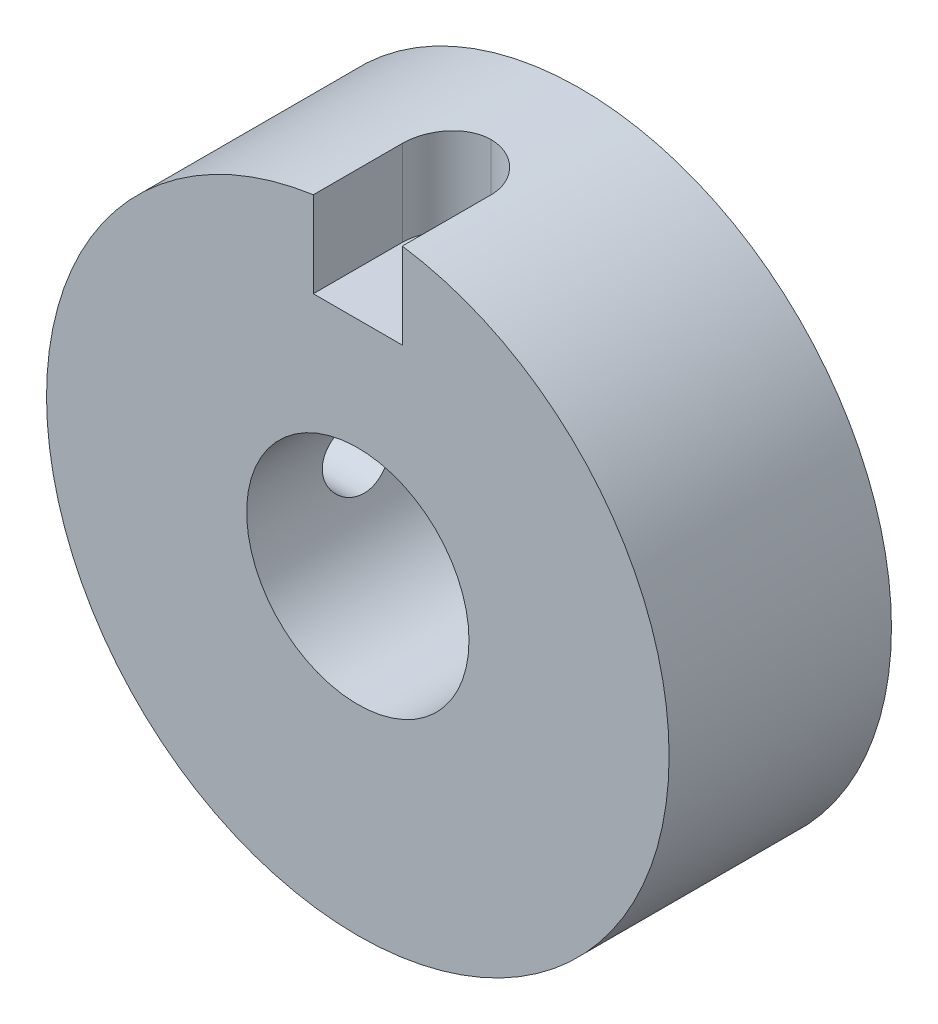
ISO-10303-21;
HEADER;
FILE_DESCRIPTION(('STEP AP214'),'2;1');
FILE_NAME('part.step','',(''),(''),'','','');
FILE_SCHEMA(('AUTOMOTIVE_DESIGN { 1 0 10303 214 1 1 1 1 }'));
ENDSEC;
DATA;
#1=APPLICATION_CONTEXT('core data for automotive mechanical design processes');
#2=APPLICATION_PROTOCOL_DEFINITION('international standard','automotive_design',2000,#1);
#3=PRODUCT_CONTEXT('',#1,'mechanical');
#4=PRODUCT('Part','Part','',(#3));
#5=PRODUCT_RELATED_PRODUCT_CATEGORY('part','',(#4));
#6=PRODUCT_DEFINITION_FORMATION('','',#4);
#7=PRODUCT_DEFINITION_CONTEXT('part definition',#1,'design');
#8=PRODUCT_DEFINITION('design','',#6,#7);
#9=PRODUCT_DEFINITION_SHAPE('','',#8);
#10=(LENGTH_UNIT() NAMED_UNIT(*) SI_UNIT(.MILLI.,.METRE.));
#11=(NAMED_UNIT(*) PLANE_ANGLE_UNIT() SI_UNIT($,.RADIAN.));
#12=(NAMED_UNIT(*) SI_UNIT($,.STERADIAN.) SOLID_ANGLE_UNIT());
#13=UNCERTAINTY_MEASURE_WITH_UNIT(LENGTH_MEASURE(1.E-05),#10,'distance_accuracy_value','');
#14=(GEOMETRIC_REPRESENTATION_CONTEXT(3) GLOBAL_UNCERTAINTY_ASSIGNED_CONTEXT((#13)) GLOBAL_UNIT_ASSIGNED_CONTEXT((#10,
#11,#12)) REPRESENTATION_CONTEXT('',''));
#15=CARTESIAN_POINT('',(0.,0.,0.));
#16=DIRECTION('',(0.,0.,1.));
#17=DIRECTION('',(1.,0.,0.));
#18=AXIS2_PLACEMENT_3D('',#15,#16,#17);
#19=CARTESIAN_POINT('',(0.,0.,0.));
#20=DIRECTION('',(0.,0.,1.));
#21=DIRECTION('',(1.,0.,0.));
#22=AXIS2_PLACEMENT_3D('',#19,#20,#21);
#23=CYLINDRICAL_SURFACE('',#22,12.5);
#24=CARTESIAN_POINT('',(-12.4996778223391,-0.0897459621555831,8.5));
#25=CARTESIAN_POINT('',(-12.4981044523452,-0.308779795776733,8.50000084706203));
#26=CARTESIAN_POINT('',(-12.4907211095766,-0.527781261981423,8.51805027812865));
#27=CARTESIAN_POINT('',(-12.4650128484776,-0.959277121958953,8.58953121023585));
#28=CARTESIAN_POINT('',(-12.4466856909387,-1.17177017469173,8.64296995250977));
#29=CARTESIAN_POINT('',(-12.4009680397116,-1.58397002797273,8.78319714131737));
#30=CARTESIAN_POINT('',(-12.3735925538041,-1.78369735180202,8.86993040293113));
#31=CARTESIAN_POINT('',(-12.3124749550891,-2.16574197133347,9.07404404306179));
#32=CARTESIAN_POINT('',(-12.2787317545973,-2.34805628465323,9.19142965869639));
#33=CARTESIAN_POINT('',(-12.2070983764861,-2.69616339041527,9.45762822606472));
#34=CARTESIAN_POINT('',(-12.1691141975337,-2.8612969600371,9.60727790169316));
#35=CARTESIAN_POINT('',(-12.0937942941893,-3.16458650573428,9.9319798457147));
#36=CARTESIAN_POINT('',(-12.0564587012965,-3.30273706790613,10.1070371996789));
#37=CARTESIAN_POINT('',(-11.9855565201995,-3.55156940278365,10.4831008964861));
#38=CARTESIAN_POINT('',(-11.9521104661916,-3.66145999403281,10.6846555486751));
#39=CARTESIAN_POINT('',(-11.8941837593139,-3.84548690546643,11.1046741770124));
#40=CARTESIAN_POINT('',(-11.8697004220964,-3.91963393301526,11.3231330665312));
#41=CARTESIAN_POINT('',(-11.8335101084463,-4.02755501232613,11.7629851131692));
#42=CARTESIAN_POINT('',(-11.8214000844247,-4.06260634646956,11.9840308239172));
#43=CARTESIAN_POINT('',(-11.8101038637609,-4.09533586524768,12.4291719116742));
#44=CARTESIAN_POINT('',(-11.8109139036736,-4.09302493301794,12.6532663816169));
#45=CARTESIAN_POINT('',(-11.8250207602558,-4.0520716189803,13.0878365656611));
#46=CARTESIAN_POINT('',(-11.8377749589872,-4.01500794872531,13.2984816247527));
#47=CARTESIAN_POINT('',(-11.8734767920111,-3.90815684783518,13.7103813497785));
#48=CARTESIAN_POINT('',(-11.8964255908698,-3.83836567856852,13.9116349399879));
#49=CARTESIAN_POINT('',(-11.950384608469,-3.66694203527177,14.3027755561789));
#50=CARTESIAN_POINT('',(-11.981517478085,-3.56481981331049,14.4924303057237));
#51=CARTESIAN_POINT('',(-12.0483400439735,-3.33198723460588,14.8524146334126));
#52=CARTESIAN_POINT('',(-12.0840310066111,-3.20126892585111,15.0227388160554));
#53=CARTESIAN_POINT('',(-12.1582110174102,-2.9072294003563,15.3482012108478));
#54=CARTESIAN_POINT('',(-12.1967506540768,-2.74260260900515,15.5021506386753));
#55=CARTESIAN_POINT('',(-12.2708260023692,-2.38942355562322,15.7805561505207));
#56=CARTESIAN_POINT('',(-12.3063614271303,-2.20086901307986,15.9050094200644));
#57=CARTESIAN_POINT('',(-12.3710119135199,-1.80253554515492,16.1219171514759));
#58=CARTESIAN_POINT('',(-12.4000575367011,-1.59255913176364,16.2140310514567));
#59=CARTESIAN_POINT('',(-12.4480673935584,-1.15892910476285,16.3612468309745));
#60=CARTESIAN_POINT('',(-12.4670348612947,-0.935279904443451,16.4163605852835));
#61=CARTESIAN_POINT('',(-12.4922836355038,-0.490379305922082,16.4859905373786));
#62=CARTESIAN_POINT('',(-12.4990483118146,-0.269398613377312,16.5020627774838));
#63=CARTESIAN_POINT('',(-12.5007627748621,0.172209937213821,16.4975138476408));
#64=CARTESIAN_POINT('',(-12.4957145151713,0.392837847563538,16.4768987450224));
#65=CARTESIAN_POINT('',(-12.4747999111584,0.821016863191551,16.4008307520688));
#66=CARTESIAN_POINT('',(-12.459241080117,1.02876118816997,16.3463715865508));
#67=CARTESIAN_POINT('',(-12.419343844758,1.43213542691959,16.2053400316766));
#68=CARTESIAN_POINT('',(-12.3950044104534,1.62776391631678,16.1187638748816));
#69=CARTESIAN_POINT('',(-12.3394340460404,2.00645888350115,15.9137040497251));
#70=CARTESIAN_POINT('',(-12.3080552601453,2.18912458598311,15.7945215285238));
#71=CARTESIAN_POINT('',(-12.2420423496594,2.53239078311192,15.528462539468));
#72=CARTESIAN_POINT('',(-12.2074073267932,2.69298515883813,15.3815784184562));
#73=CARTESIAN_POINT('',(-12.1370667660441,2.99442399901125,15.0571301157744));
#74=CARTESIAN_POINT('',(-12.1013759157265,3.13418213246274,14.8785512226872));
#75=CARTESIAN_POINT('',(-12.0345085850012,3.3818810481371,14.4997523114599));
#76=CARTESIAN_POINT('',(-12.0033321029297,3.48982184208676,14.2995323012961));
#77=CARTESIAN_POINT('',(-11.9493660479752,3.67036328889093,13.8830988415737));
#78=CARTESIAN_POINT('',(-11.9265604927611,3.74303137322143,13.6669168261438));
#79=CARTESIAN_POINT('',(-11.8922509031079,3.85066493623664,13.2245230262504));
#80=CARTESIAN_POINT('',(-11.8807425273946,3.88564489819771,12.9983151294805));
#81=CARTESIAN_POINT('',(-11.8708251416354,3.91583157516731,12.5532716606386));
#82=CARTESIAN_POINT('',(-11.8718480956732,3.9127629259007,12.3345644225548));
#83=CARTESIAN_POINT('',(-11.8854867939859,3.87113320275414,11.9009418113832));
#84=CARTESIAN_POINT('',(-11.898101966398,3.83257387968632,11.6860262517789));
#85=CARTESIAN_POINT('',(-11.9330682019857,3.72224781420406,11.2693702671742));
#86=CARTESIAN_POINT('',(-11.95526556233,3.65100425481284,11.0674774118319));
#87=CARTESIAN_POINT('',(-12.0068078990468,3.477742861443,10.6783495541493));
#88=CARTESIAN_POINT('',(-12.0361543479721,3.37571868631014,10.4911175821368));
#89=CARTESIAN_POINT('',(-12.1000622843927,3.13911557554125,10.1286922572677));
#90=CARTESIAN_POINT('',(-12.1347829078743,3.00341894046459,9.9542567078173));
#91=CARTESIAN_POINT('',(-12.2047139736414,2.70524916480784,9.63006498979919));
#92=CARTESIAN_POINT('',(-12.2399245415843,2.54276903462859,9.4803152838703));
#93=CARTESIAN_POINT('',(-12.3081473969799,2.18927005128843,9.20486773777867));
#94=CARTESIAN_POINT('',(-12.3410509332938,1.99749484526288,9.08011062870025));
#95=CARTESIAN_POINT('',(-12.3995350062219,1.59463647980861,8.86475945789312));
#96=CARTESIAN_POINT('',(-12.4251182076853,1.38356038357415,8.77415296036855));
#97=CARTESIAN_POINT('',(-12.4643985330404,0.964250615370552,8.63552252431404));
#98=CARTESIAN_POINT('',(-12.4788351696646,0.756962585041859,8.58484350576535));
#99=CARTESIAN_POINT('',(-12.4972391526811,0.336523337318486,8.51708537459931));
#100=CARTESIAN_POINT('',(-12.5012087070917,0.123373366080645,8.49999917581093));
#101=CARTESIAN_POINT('',(-12.4996778223391,-0.0897459621555831,8.5));
#102=B_SPLINE_CURVE_WITH_KNOTS('',3,(#24,#25,#26,#27,#28,#29,#30,#31,#32,#33,#34,#35,#36,#37,
#38,#39,#40,#41,#42,#43,#44,#45,#46,#47,#48,#49,#50,#51,#52,#53,#54,#55,#56,#57,#58,#59,#60,#61,
#62,#63,#64,#65,#66,#67,#68,#69,#70,#71,#72,#73,#74,#75,#76,#77,#78,#79,#80,#81,#82,#83,#84,#85,
#86,#87,#88,#89,#90,#91,#92,#93,#94,#95,#96,#97,#98,#99,#100,#101),.UNSPECIFIED.,.T.,.F.,(4,2,2,
2,2,2,2,2,2,2,2,2,2,2,2,2,2,2,2,2,2,2,2,2,2,2,2,2,2,2,2,2,2,2,2,2,2,2,4),(0.,0.656332500111828,
1.31279933812617,1.96818276264653,2.62367823626036,3.29882650153832,3.97411009054382,
4.66663091861036,5.35894416559027,6.02790842814876,6.69667783374932,7.33646706114502,
7.97632939278524,8.62638962466568,9.27663085586789,9.95945828079062,10.6423508337604,
11.3322331272658,12.0218939049888,12.6835806324671,13.3451579407781,13.9881724023181,
14.6312623156306,15.2893918229874,15.9477034197023,16.6331381594277,17.3185726465248,
18.002691564177,18.6865474859389,19.3395239310475,19.9924681655022,20.6353068695584,
21.2782780961774,21.946410008502,22.6147165578184,23.3047603232122,23.9945525688614,
24.633297071077,25.2719068201323),.UNSPECIFIED.);
#103=CARTESIAN_POINT('',(-12.4996778223391,-0.0897459621555831,8.5));
#104=VERTEX_POINT('',#103);
#105=EDGE_CURVE('E175',#104,#104,#102,.T.);
#106=ORIENTED_EDGE('',*,*,#105,.T.);
#107=EDGE_LOOP('',(#106));
#108=FACE_BOUND('',#107,.T.);
#109=CARTESIAN_POINT('',(0.,0.,25.));
#110=DIRECTION('',(0.,0.,1.));
#111=DIRECTION('',(1.,0.,0.));
#112=AXIS2_PLACEMENT_3D('',#109,#110,#111);
#113=CIRCLE('',#112,12.5);
#114=CARTESIAN_POINT('',(12.5,0.,25.));
#115=VERTEX_POINT('',#114);
#116=EDGE_CURVE('E117',#115,#115,#113,.T.);
#117=ORIENTED_EDGE('',*,*,#116,.T.);
#118=EDGE_LOOP('',(#117));
#119=FACE_BOUND('',#118,.T.);
#120=CARTESIAN_POINT('',(0.,0.,5.));
#121=DIRECTION('',(0.,0.,-1.));
#122=DIRECTION('',(-1.,0.,0.));
#123=AXIS2_PLACEMENT_3D('',#120,#121,#122);
#124=CIRCLE('',#123,12.5);
#125=CARTESIAN_POINT('',(-12.5,0.,5.));
#126=VERTEX_POINT('',#125);
#127=EDGE_CURVE('E271',#126,#126,#124,.F.);
#128=ORIENTED_EDGE('',*,*,#127,.F.);
#129=EDGE_LOOP('',(#128));
#130=FACE_BOUND('',#129,.T.);
#131=ADVANCED_FACE('F34',(#108,#119,#130),#23,.F.);
#132=CARTESIAN_POINT('',(0.,0.,25.));
#133=DIRECTION('',(0.,0.,-1.));
#134=DIRECTION('',(-1.,0.,0.));
#135=AXIS2_PLACEMENT_3D('',#132,#133,#134);
#136=CYLINDRICAL_SURFACE('',#135,35.);
#137=CARTESIAN_POINT('',(-35.0000000000001,0.,16.4989930810489));
#138=CARTESIAN_POINT('',(-34.9999970799338,-0.22381283630756,16.5040063197184));
#139=CARTESIAN_POINT('',(-34.9978303996862,-0.448191779585311,16.4901894098136));
#140=CARTESIAN_POINT('',(-34.9893474086651,-0.891562938644005,16.4252253244465));
#141=CARTESIAN_POINT('',(-34.9830266696301,-1.11054914698585,16.3740383056725));
#142=CARTESIAN_POINT('',(-34.9669011318205,-1.53663814911991,16.2358552281324));
#143=CARTESIAN_POINT('',(-34.9570985600665,-1.74374844076855,16.1488820529863));
#144=CARTESIAN_POINT('',(-34.9350578394941,-2.14038258182215,15.9416503070904));
#145=CARTESIAN_POINT('',(-34.9228201359081,-2.32990963681924,15.8213978194625));
#146=CARTESIAN_POINT('',(-34.8971724434096,-2.68692574066268,15.5504236748411));
#147=CARTESIAN_POINT('',(-34.8837577945171,-2.85431994062399,15.3995774832964));
#148=CARTESIAN_POINT('',(-34.8572642602799,-3.16147949136571,15.0719410149016));
#149=CARTESIAN_POINT('',(-34.8441853922255,-3.30124342186839,14.8951494051936));
#150=CARTESIAN_POINT('',(-34.8197652662906,-3.54959442137343,14.5199546829983));
#151=CARTESIAN_POINT('',(-34.8084296141566,-3.65808185242997,14.321485220343));
#152=CARTESIAN_POINT('',(-34.7888150567153,-3.84015355880175,13.9089936563732));
#153=CARTESIAN_POINT('',(-34.780536056756,-3.91373891491091,13.6949720368908));
#154=CARTESIAN_POINT('',(-34.7679979067452,-4.02360467929546,13.2584194765897));
#155=CARTESIAN_POINT('',(-34.7637216907524,-4.06004352218763,13.0359289093076));
#156=CARTESIAN_POINT('',(-34.7596116919775,-4.09508464716385,12.5879512771634));
#157=CARTESIAN_POINT('',(-34.759777742908,-4.09368834552939,12.3624643247806));
#158=CARTESIAN_POINT('',(-34.7645202688499,-4.05321205569976,11.9161456870668));
#159=CARTESIAN_POINT('',(-34.7690736109369,-4.01432971995838,11.6952957902532));
#160=CARTESIAN_POINT('',(-34.7820471144753,-3.90031530797844,11.2632815529854));
#161=CARTESIAN_POINT('',(-34.7904673307684,-3.82518271762309,11.0521173499444));
#162=CARTESIAN_POINT('',(-34.8102592327458,-3.64066362998438,10.6449991517272));
#163=CARTESIAN_POINT('',(-34.8216364707094,-3.53121261372714,10.4490746805148));
#164=CARTESIAN_POINT('',(-34.846081760202,-3.28120520500788,10.0783092975767));
#165=CARTESIAN_POINT('',(-34.8591498796134,-3.14064756357024,9.90346923285575));
#166=CARTESIAN_POINT('',(-34.8856326222623,-2.8313968042986,9.57871072429288));
#167=CARTESIAN_POINT('',(-34.8990488743943,-2.66253708024414,9.42895102315992));
#168=CARTESIAN_POINT('',(-34.9246810766014,-2.30201080976796,9.15986816476534));
#169=CARTESIAN_POINT('',(-34.9368970183964,-2.11034410603638,9.04054521745737));
#170=CARTESIAN_POINT('',(-34.9588094565913,-1.70937005883019,8.83563683961237));
#171=CARTESIAN_POINT('',(-34.9685034229222,-1.50004527718399,8.75008524464934));
#172=CARTESIAN_POINT('',(-34.9843061536437,-1.06986373975857,8.61539406812959));
#173=CARTESIAN_POINT('',(-34.9904150545944,-0.849007423579764,8.56625309962524));
#174=CARTESIAN_POINT('',(-34.9983816935165,-0.403322954796371,8.50600957116005));
#175=CARTESIAN_POINT('',(-35.000262495863,-0.1785231261245,8.49470047151861));
#176=CARTESIAN_POINT('',(-34.9996780104286,0.26978711520317,8.50988263907198));
#177=CARTESIAN_POINT('',(-34.9972128193308,0.493297556432287,8.53637306535893));
#178=CARTESIAN_POINT('',(-34.9882773195983,0.931893792185184,8.62621714827235));
#179=CARTESIAN_POINT('',(-34.9818207423547,1.14700579340009,8.68944437624782));
#180=CARTESIAN_POINT('',(-34.9656794133726,1.5635701557323,8.85082991250406));
#181=CARTESIAN_POINT('',(-34.9559945811477,1.76502217612949,8.94898909170923));
#182=CARTESIAN_POINT('',(-34.9344726754701,2.14938551219707,9.17787576721054));
#183=CARTESIAN_POINT('',(-34.9226276640814,2.33222443621588,9.30872406368674));
#184=CARTESIAN_POINT('',(-34.8981679194916,2.67342278527895,9.59912261922893));
#185=CARTESIAN_POINT('',(-34.8855531597595,2.8317813658938,9.75867386796918));
#186=CARTESIAN_POINT('',(-34.8609327580229,3.12033617532201,10.1029054998055));
#187=CARTESIAN_POINT('',(-34.8489304851224,3.25038730388308,10.2877078004653));
#188=CARTESIAN_POINT('',(-34.826990529341,3.47761617700365,10.6766377015351));
#189=CARTESIAN_POINT('',(-34.8170528210977,3.574794325404,10.8807650644994));
#190=CARTESIAN_POINT('',(-34.8004097169839,3.73334563262992,11.3022562495142));
#191=CARTESIAN_POINT('',(-34.7936994372844,3.79477292037042,11.5195995079044));
#192=CARTESIAN_POINT('',(-34.7842725175655,3.88023970151644,11.961598880933));
#193=CARTESIAN_POINT('',(-34.7815557285009,3.90428059025975,12.1862547223312));
#194=CARTESIAN_POINT('',(-34.7804369840225,3.9142339662517,12.6351566524629));
#195=CARTESIAN_POINT('',(-34.7820109484919,3.90035923848038,12.8593979894996));
#196=CARTESIAN_POINT('',(-34.7892392225097,3.83534691718559,13.3023418069826));
#197=CARTESIAN_POINT('',(-34.7948935216007,3.78420941916122,13.5210443016227));
#198=CARTESIAN_POINT('',(-34.8096229831308,3.64622005713356,13.9465651286177));
#199=CARTESIAN_POINT('',(-34.8186955810332,3.5593949628819,14.1533922366128));
#200=CARTESIAN_POINT('',(-34.8392213897563,3.35252252570927,14.5495677332788));
#201=CARTESIAN_POINT('',(-34.8506746056455,3.23247511205728,14.7389160847358));
#202=CARTESIAN_POINT('',(-34.874719689353,2.9618279430943,15.0958268161993));
#203=CARTESIAN_POINT('',(-34.8873171553784,2.81107293783469,15.2632710940506));
#204=CARTESIAN_POINT('',(-34.9121577813129,2.48357516514696,15.5705776322525));
#205=CARTESIAN_POINT('',(-34.9244008559093,2.30682620143914,15.7104332975371));
#206=CARTESIAN_POINT('',(-34.9471603858622,1.93167941358626,15.9589968466201));
#207=CARTESIAN_POINT('',(-34.9576708250251,1.73320997955725,16.0675971374813));
#208=CARTESIAN_POINT('',(-34.9756738717833,1.32085287687288,16.2497878913813));
#209=CARTESIAN_POINT('',(-34.9831698062657,1.10698251426872,16.3234169659264));
#210=CARTESIAN_POINT('',(-34.992409066798,0.743318422369124,16.4151611579264));
#211=CARTESIAN_POINT('',(-34.9952384211033,0.596075374421462,16.4436115763159));
#212=CARTESIAN_POINT('',(-34.9990348596407,0.299306053661318,16.4838500146549));
#213=CARTESIAN_POINT('',(-35.0000019541638,0.14977979347069,16.495638126682));
#214=CARTESIAN_POINT('',(-35.0000000000001,0.,16.4989930810489));
#215=B_SPLINE_CURVE_WITH_KNOTS('',3,(#137,#138,#139,#140,#141,#142,#143,#144,#145,#146,#147,
#148,#149,#150,#151,#152,#153,#154,#155,#156,#157,#158,#159,#160,#161,#162,#163,#164,#165,#166,
#167,#168,#169,#170,#171,#172,#173,#174,#175,#176,#177,#178,#179,#180,#181,#182,#183,#184,#185,
#186,#187,#188,#189,#190,#191,#192,#193,#194,#195,#196,#197,#198,#199,#200,#201,#202,#203,#204,
#205,#206,#207,#208,#209,#210,#211,#212,#213,#214),.UNSPECIFIED.,.T.,.F.,(4,2,2,2,2,2,2,2,2,2,2,
2,2,2,2,2,2,2,2,2,2,2,2,2,2,2,2,2,2,2,2,2,2,2,2,2,2,2,4),(0.,0.67105988217759,1.34283628266493,
2.01418377863919,2.68540864004013,3.35942269571216,4.03347138870067,4.70964426073989,
5.38579619272779,6.05905202990151,6.73228266515056,7.40198286459342,8.0716925622935,
8.74266894720436,9.41367227766898,10.088774061118,10.7638805013135,11.4396616253982,
12.1154170064155,12.7874770879816,13.4595222187838,14.1292681105555,14.7990307016208,
15.4713059408474,16.1436043644862,16.8192717276001,17.4949307899155,18.1695641852072,
18.8441724011798,19.5150024573678,20.1858307943212,20.8561568494747,21.5264843317774,
22.2002889130775,22.8742543728852,23.5505128637089,24.2260229559543,24.6751114338833,
25.1241974300989),.UNSPECIFIED.);
#216=CARTESIAN_POINT('',(-35.0000000000001,0.,16.4989930810489));
#217=VERTEX_POINT('',#216);
#218=EDGE_CURVE('E11',#217,#217,#215,.T.);
#219=ORIENTED_EDGE('',*,*,#218,.T.);
#220=EDGE_LOOP('',(#219));
#221=FACE_BOUND('',#220,.T.);
#222=CARTESIAN_POINT('',(0.,0.,25.));
#223=DIRECTION('',(0.,0.,1.));
#224=DIRECTION('',(1.,0.,0.));
#225=AXIS2_PLACEMENT_3D('',#222,#223,#224);
#226=CIRCLE('',#225,35.);
#227=CARTESIAN_POINT('',(-5.,34.6410161513776,25.0000000000001));
#228=VERTEX_POINT('',#227);
#229=CARTESIAN_POINT('',(5.,34.6410161513776,25.0000000000001));
#230=VERTEX_POINT('',#229);
#231=EDGE_CURVE('E109',#228,#230,#226,.T.);
#232=ORIENTED_EDGE('',*,*,#231,.F.);
#233=DIRECTION('',(0.,0.,-1.));
#234=VECTOR('',#233,1.);
#235=CARTESIAN_POINT('',(-5.,34.6410161513776,25.0000000000001));
#236=LINE('',#235,#234);
#237=CARTESIAN_POINT('',(-5.,34.6410161513775,15.0000000000001));
#238=VERTEX_POINT('',#237);
#239=EDGE_CURVE('E115',#228,#238,#236,.T.);
#240=ORIENTED_EDGE('',*,*,#239,.T.);
#241=CARTESIAN_POINT('',(-5.,34.6410161513775,15.0000000000001));
#242=CARTESIAN_POINT('',(-5.00001591400448,34.6410074254654,14.8601331524567));
#243=CARTESIAN_POINT('',(-4.99413186280085,34.6418629460145,14.7202695523683));
#244=CARTESIAN_POINT('',(-4.9706795115777,34.6452392758598,14.4415572670852));
#245=CARTESIAN_POINT('',(-4.95311221810869,34.6477599416981,14.3027084955014));
#246=CARTESIAN_POINT('',(-4.90643652423589,34.6543994667686,14.0271721683406));
#247=CARTESIAN_POINT('',(-4.87734173815598,34.6585164405899,13.8904822603968));
#248=CARTESIAN_POINT('',(-4.80783407934852,34.6682270960263,13.6200661164436));
#249=CARTESIAN_POINT('',(-4.76742125271319,34.6738207716276,13.4863398683672));
#250=CARTESIAN_POINT('',(-4.67557011081946,34.6863256678611,13.2227766471096));
#251=CARTESIAN_POINT('',(-4.62413057236637,34.6932370346556,13.092940107237));
#252=CARTESIAN_POINT('',(-4.51058295782812,34.7081823220314,12.838029452486));
#253=CARTESIAN_POINT('',(-4.44847095316519,34.7162166557775,12.7129571121146));
#254=CARTESIAN_POINT('',(-4.31406296068151,34.7331749859888,12.4685369564341));
#255=CARTESIAN_POINT('',(-4.24177091292844,34.742098637865,12.3491869502061));
#256=CARTESIAN_POINT('',(-4.08746793098905,34.7605903768907,12.1169373479455));
#257=CARTESIAN_POINT('',(-4.00545359999447,34.7701586887671,12.0040400269166));
#258=CARTESIAN_POINT('',(-3.83176003564179,34.7897297720872,11.7848342157263));
#259=CARTESIAN_POINT('',(-3.74002406184518,34.7997348683032,11.6785708890015));
#260=CARTESIAN_POINT('',(-3.54795017067548,34.8198416284603,11.4741353692262));
#261=CARTESIAN_POINT('',(-3.44761222326593,34.8299432927384,11.3759632044309));
#262=CARTESIAN_POINT('',(-3.23899111179316,34.8499629634003,11.1883568776287));
#263=CARTESIAN_POINT('',(-3.1307050587502,34.8598809013463,11.098925920694));
#264=CARTESIAN_POINT('',(-2.90700815567607,34.8792474208842,10.9294983791965));
#265=CARTESIAN_POINT('',(-2.79159979697964,34.8886961645334,10.8494985238755));
#266=CARTESIAN_POINT('',(-2.55383451398512,34.9069077968777,10.6990913866128));
#267=CARTESIAN_POINT('',(-2.43144600764246,34.9156670571346,10.6287335739315));
#268=CARTESIAN_POINT('',(-2.18115374047268,34.9321956414937,10.4986161137234));
#269=CARTESIAN_POINT('',(-2.05325202735979,34.9399653289739,10.4388525727284));
#270=CARTESIAN_POINT('',(-1.79283272437051,34.9542950387279,10.3303494071205));
#271=CARTESIAN_POINT('',(-1.660316676645,34.9608554606221,10.2816061394787));
#272=CARTESIAN_POINT('',(-1.39163498907484,34.9725813991628,10.1954956134274));
#273=CARTESIAN_POINT('',(-1.25547024258644,34.9777472538895,10.1581255975595));
#274=CARTESIAN_POINT('',(-0.934716754454143,34.9879952305847,10.0845566538025));
#275=CARTESIAN_POINT('',(-0.749045323123257,34.9924813701557,10.05285659225));
#276=CARTESIAN_POINT('',(-0.468931164150102,34.996983502609,10.0211502433338));
#277=CARTESIAN_POINT('',(-0.375328275023661,34.998113027132,10.0132220913652));
#278=CARTESIAN_POINT('',(-0.187825091495894,34.9996216382507,10.0026475866273));
#279=CARTESIAN_POINT('',(-0.0939248181863751,35.0000007769238,10.0000008673215));
#280=CARTESIAN_POINT('',(0.,35.,10.0000000000001));
#281=B_SPLINE_CURVE_WITH_KNOTS('',3,(#241,#242,#243,#244,#245,#246,#247,#248,#249,#250,#251,
#252,#253,#254,#255,#256,#257,#258,#259,#260,#261,#262,#263,#264,#265,#266,#267,#268,#269,#270,
#271,#272,#273,#274,#275,#276,#277,#278,#279,#280),.UNSPECIFIED.,.F.,.F.,(4,2,2,2,2,2,2,2,2,2,2,
2,2,2,2,2,2,2,2,4),(0.,0.419469433101484,0.838902732184764,1.25784213721246,1.67677983615248,
2.09576403198191,2.51490278928831,2.93387976740155,3.3530035631292,3.7747245051806,
4.19644691986151,4.61832338875554,5.04005311544617,5.46387145307362,5.88753371015463,
6.31105570955482,6.7344749435878,7.29832251378616,7.58002954808517,7.86171703095847),.UNSPECIFIED.);
#282=CARTESIAN_POINT('',(0.,35.,10.0000000000001));
#283=VERTEX_POINT('',#282);
#284=EDGE_CURVE('E55',#238,#283,#281,.T.);
#285=ORIENTED_EDGE('',*,*,#284,.T.);
#286=CARTESIAN_POINT('',(0.,35.,10.0000000000001));
#287=CARTESIAN_POINT('',(0.139874224407653,35.0000083920871,9.99998410242833));
#288=CARTESIAN_POINT('',(0.279745244128696,34.9991617982513,10.0058687574901));
#289=CARTESIAN_POINT('',(0.558472784081779,34.9958193830043,10.0293236405247));
#290=CARTESIAN_POINT('',(0.697329389321679,34.9933237014275,10.0468928777059));
#291=CARTESIAN_POINT('',(0.972882854564895,34.9867476831075,10.0935741181447));
#292=CARTESIAN_POINT('',(1.10958205030554,34.9826692028878,10.1226725991575));
#293=CARTESIAN_POINT('',(1.38001689533606,34.9730446244359,10.1921894519083));
#294=CARTESIAN_POINT('',(1.51375255768203,34.9674985326708,10.2326077737649));
#295=CARTESIAN_POINT('',(1.77733525397384,34.9550925307143,10.3244720732068));
#296=CARTESIAN_POINT('',(1.9071818290593,34.9482324661922,10.3759193462652));
#297=CARTESIAN_POINT('',(2.16211169292466,34.9333877943281,10.4894843170293));
#298=CARTESIAN_POINT('',(2.28719320706375,34.9254027731233,10.5516059436028));
#299=CARTESIAN_POINT('',(2.53162972607197,34.9085355773615,10.6860344688269));
#300=CARTESIAN_POINT('',(2.65098694426714,34.8996537537504,10.7583373875684));
#301=CARTESIAN_POINT('',(2.88324895515185,34.881233550825,10.9126630919542));
#302=CARTESIAN_POINT('',(2.99615147227996,34.8716949425464,10.9946892745283));
#303=CARTESIAN_POINT('',(3.2153496947839,34.8521693631769,11.1683946252372));
#304=CARTESIAN_POINT('',(3.32160126718999,34.8421800274068,11.2601292233347));
#305=CARTESIAN_POINT('',(3.52601320151653,34.8220875427778,11.4521978910343));
#306=CARTESIAN_POINT('',(3.62417353435827,34.81198439351,11.5525319915391));
#307=CARTESIAN_POINT('',(3.811756820383,34.7919446607698,11.7611431762407));
#308=CARTESIAN_POINT('',(3.90117654213911,34.7820081400167,11.8694231723494));
#309=CARTESIAN_POINT('',(4.0705824924546,34.7625894783111,12.0931056768624));
#310=CARTESIAN_POINT('',(4.1505719897046,34.7531071805969,12.2085056960816));
#311=CARTESIAN_POINT('',(4.3009674575349,34.73481609494,12.4462645178848));
#312=CARTESIAN_POINT('',(4.37132294462944,34.7260109535044,12.5686555453924));
#313=CARTESIAN_POINT('',(4.50143547857346,34.7093846165121,12.8189526710584));
#314=CARTESIAN_POINT('',(4.56119641921716,34.7015630597688,12.9468567214507));
#315=CARTESIAN_POINT('',(4.66969408079195,34.687129539056,13.2072804907397));
#316=CARTESIAN_POINT('',(4.71843448211651,34.6805171714101,13.3397986516073));
#317=CARTESIAN_POINT('',(4.80453918888592,34.668693151896,13.6084850352683));
#318=CARTESIAN_POINT('',(4.84190625455965,34.6634811602026,13.7446523636918));
#319=CARTESIAN_POINT('',(4.91546224962509,34.6531394518743,14.0653873054892));
#320=CARTESIAN_POINT('',(4.94715506304332,34.6486096596153,14.2510371493165));
#321=CARTESIAN_POINT('',(4.9788543402274,34.6440630416108,14.5311195939578));
#322=CARTESIAN_POINT('',(4.98678076838435,34.6429221877529,14.6247122962221));
#323=CARTESIAN_POINT('',(4.99735298440992,34.6413983560082,14.8121951648805));
#324=CARTESIAN_POINT('',(4.99999913679258,34.6410153258065,14.906085310293));
#325=CARTESIAN_POINT('',(5.,34.6410161513776,15.0000000000001));
#326=B_SPLINE_CURVE_WITH_KNOTS('',3,(#286,#287,#288,#289,#290,#291,#292,#293,#294,#295,#296,
#297,#298,#299,#300,#301,#302,#303,#304,#305,#306,#307,#308,#309,#310,#311,#312,#313,#314,#315,
#316,#317,#318,#319,#320,#321,#322,#323,#324,#325),.UNSPECIFIED.,.F.,.F.,(4,2,2,2,2,2,2,2,2,2,2,
2,2,2,2,2,2,2,2,4),(0.,0.4194916677011,0.838947769232095,1.25791335487725,1.67687709436757,
2.09589007280252,2.5150576073653,2.93406174013899,3.35321269047718,3.77490104140786,
4.19659090775853,4.61843608894972,5.04013461818406,5.46396462185954,5.88763853167557,
6.31117074267842,6.73460008326993,7.29838340729954,7.58005994995564,7.86171704692061),.UNSPECIFIED.);
#327=CARTESIAN_POINT('',(5.,34.6410161513775,15.0000000000001));
#328=VERTEX_POINT('',#327);
#329=EDGE_CURVE('E48',#283,#328,#326,.T.);
#330=ORIENTED_EDGE('',*,*,#329,.T.);
#331=DIRECTION('',(0.,0.,-1.));
#332=VECTOR('',#331,1.);
#333=CARTESIAN_POINT('',(5.,34.6410161513776,25.0000000000001));
#334=LINE('',#333,#332);
#335=EDGE_CURVE('E94',#328,#230,#334,.F.);
#336=ORIENTED_EDGE('',*,*,#335,.T.);
#337=EDGE_LOOP('',(#232,#240,#285,#330,#336));
#338=FACE_BOUND('',#337,.T.);
#339=CARTESIAN_POINT('',(0.,0.,0.));
#340=DIRECTION('',(0.,0.,1.));
#341=DIRECTION('',(1.,0.,0.));
#342=AXIS2_PLACEMENT_3D('',#339,#340,#341);
#343=CIRCLE('',#342,35.);
#344=CARTESIAN_POINT('',(35.,0.,0.));
#345=VERTEX_POINT('',#344);
#346=EDGE_CURVE('E120',#345,#345,#343,.T.);
#347=ORIENTED_EDGE('',*,*,#346,.T.);
#348=EDGE_LOOP('',(#347));
#349=FACE_BOUND('',#348,.T.);
#350=ADVANCED_FACE('F144',(#221,#338,#349),#136,.T.);
#351=CARTESIAN_POINT('',(0.,0.,25.));
#352=DIRECTION('',(0.,0.,1.));
#353=DIRECTION('',(1.,0.,0.));
#354=AXIS2_PLACEMENT_3D('',#351,#352,#353);
#355=PLANE('',#354);
#356=DIRECTION('',(0.,-1.,0.));
#357=VECTOR('',#356,1.);
#358=CARTESIAN_POINT('',(-5.,0.,25.));
#359=LINE('',#358,#357);
#360=CARTESIAN_POINT('',(-5.,25.0000000000001,25.0000000000001));
#361=VERTEX_POINT('',#360);
#362=EDGE_CURVE('E122',#228,#361,#359,.T.);
#363=ORIENTED_EDGE('',*,*,#362,.F.);
#364=ORIENTED_EDGE('',*,*,#231,.T.);
#365=DIRECTION('',(0.,1.,0.));
#366=VECTOR('',#365,1.);
#367=CARTESIAN_POINT('',(5.,40.7348625763076,25.0000000000001));
#368=LINE('',#367,#366);
#369=CARTESIAN_POINT('',(5.,25.0000000000001,25.));
#370=VERTEX_POINT('',#369);
#371=EDGE_CURVE('E88',#370,#230,#368,.T.);
#372=ORIENTED_EDGE('',*,*,#371,.F.);
#373=DIRECTION('',(1.,0.,0.));
#374=VECTOR('',#373,1.);
#375=CARTESIAN_POINT('',(-5.,25.0000000000001,25.0000000000001));
#376=LINE('',#375,#374);
#377=EDGE_CURVE('E98',#361,#370,#376,.T.);
#378=ORIENTED_EDGE('',*,*,#377,.F.);
#379=EDGE_LOOP('',(#363,#364,#372,#378));
#380=FACE_BOUND('',#379,.T.);
#381=ORIENTED_EDGE('',*,*,#116,.F.);
#382=EDGE_LOOP('',(#381));
#383=FACE_BOUND('',#382,.T.);
#384=ADVANCED_FACE('F106',(#380,#383),#355,.T.);
#385=CARTESIAN_POINT('',(0.,0.,0.));
#386=DIRECTION('',(0.,0.,1.));
#387=DIRECTION('',(1.,0.,0.));
#388=AXIS2_PLACEMENT_3D('',#385,#386,#387);
#389=PLANE('',#388);
#390=CARTESIAN_POINT('',(0.,0.,0.));
#391=DIRECTION('',(0.,0.,-1.));
#392=DIRECTION('',(-1.,0.,0.));
#393=AXIS2_PLACEMENT_3D('',#390,#391,#392);
#394=CIRCLE('',#393,22.5);
#395=CARTESIAN_POINT('',(-22.5,0.,0.));
#396=VERTEX_POINT('',#395);
#397=EDGE_CURVE('E180',#396,#396,#394,.T.);
#398=ORIENTED_EDGE('',*,*,#397,.F.);
#399=EDGE_LOOP('',(#398));
#400=FACE_BOUND('',#399,.T.);
#401=ORIENTED_EDGE('',*,*,#346,.F.);
#402=EDGE_LOOP('',(#401));
#403=FACE_BOUND('',#402,.T.);
#404=ADVANCED_FACE('F243',(#400,#403),#389,.F.);
#405=CARTESIAN_POINT('',(-5.,40.7348625763075,10.0000000000001));
#406=DIRECTION('',(-1.,0.,0.));
#407=DIRECTION('',(0.,0.,1.));
#408=AXIS2_PLACEMENT_3D('',#405,#406,#407);
#409=PLANE('',#408);
#410=DIRECTION('',(0.,0.,1.));
#411=VECTOR('',#410,1.);
#412=CARTESIAN_POINT('',(-5.,25.,10.0000000000001));
#413=LINE('',#412,#411);
#414=CARTESIAN_POINT('',(-5.,25.,15.0000000000001));
#415=VERTEX_POINT('',#414);
#416=EDGE_CURVE('E95',#415,#361,#413,.T.);
#417=ORIENTED_EDGE('',*,*,#416,.F.);
#418=DIRECTION('',(0.,-1.,0.));
#419=VECTOR('',#418,1.);
#420=CARTESIAN_POINT('',(-5.,40.7348625763075,15.0000000000001));
#421=LINE('',#420,#419);
#422=EDGE_CURVE('E130',#415,#238,#421,.F.);
#423=ORIENTED_EDGE('',*,*,#422,.T.);
#424=ORIENTED_EDGE('',*,*,#239,.F.);
#425=ORIENTED_EDGE('',*,*,#362,.T.);
#426=EDGE_LOOP('',(#417,#423,#424,#425));
#427=FACE_BOUND('',#426,.T.);
#428=ADVANCED_FACE('F172',(#427),#409,.F.);
#429=CARTESIAN_POINT('',(5.,40.7348625763075,10.0000000000001));
#430=DIRECTION('',(1.,0.,0.));
#431=DIRECTION('',(0.,1.,0.));
#432=AXIS2_PLACEMENT_3D('',#429,#430,#431);
#433=PLANE('',#432);
#434=ORIENTED_EDGE('',*,*,#335,.F.);
#435=DIRECTION('',(0.,1.,0.));
#436=VECTOR('',#435,1.);
#437=CARTESIAN_POINT('',(5.,40.7348625763075,15.0000000000001));
#438=LINE('',#437,#436);
#439=CARTESIAN_POINT('',(5.,25.,15.0000000000001));
#440=VERTEX_POINT('',#439);
#441=EDGE_CURVE('E91',#328,#440,#438,.F.);
#442=ORIENTED_EDGE('',*,*,#441,.T.);
#443=DIRECTION('',(0.,0.,1.));
#444=VECTOR('',#443,1.);
#445=CARTESIAN_POINT('',(5.,25.,10.0000000000001));
#446=LINE('',#445,#444);
#447=EDGE_CURVE('E84',#440,#370,#446,.T.);
#448=ORIENTED_EDGE('',*,*,#447,.T.);
#449=ORIENTED_EDGE('',*,*,#371,.T.);
#450=EDGE_LOOP('',(#434,#442,#448,#449));
#451=FACE_BOUND('',#450,.T.);
#452=ADVANCED_FACE('F86',(#451),#433,.F.);
#453=CARTESIAN_POINT('',(-5.,25.,10.0000000000001));
#454=DIRECTION('',(0.,-1.,0.));
#455=DIRECTION('',(0.,0.,-1.));
#456=AXIS2_PLACEMENT_3D('',#453,#454,#455);
#457=PLANE('',#456);
#458=CARTESIAN_POINT('',(0.,25.,15.0000000000001));
#459=DIRECTION('',(0.,-1.,0.));
#460=DIRECTION('',(0.,0.,-1.));
#461=AXIS2_PLACEMENT_3D('',#458,#459,#460);
#462=CIRCLE('',#461,5.);
#463=CARTESIAN_POINT('',(0.,25.,10.0000000000001));
#464=VERTEX_POINT('',#463);
#465=EDGE_CURVE('E126',#440,#464,#462,.F.);
#466=ORIENTED_EDGE('',*,*,#465,.T.);
#467=CARTESIAN_POINT('',(0.,25.,15.0000000000001));
#468=DIRECTION('',(0.,-1.,0.));
#469=DIRECTION('',(0.,0.,-1.));
#470=AXIS2_PLACEMENT_3D('',#467,#468,#469);
#471=CIRCLE('',#470,5.);
#472=EDGE_CURVE('E128',#464,#415,#471,.F.);
#473=ORIENTED_EDGE('',*,*,#472,.T.);
#474=ORIENTED_EDGE('',*,*,#416,.T.);
#475=ORIENTED_EDGE('',*,*,#377,.T.);
#476=ORIENTED_EDGE('',*,*,#447,.F.);
#477=EDGE_LOOP('',(#466,#473,#474,#475,#476));
#478=FACE_BOUND('',#477,.T.);
#479=ADVANCED_FACE('F99',(#478),#457,.F.);
#480=CARTESIAN_POINT('',(0.,25.,15.0000000000001));
#481=DIRECTION('',(0.,1.,0.));
#482=DIRECTION('',(-1.,0.,0.));
#483=AXIS2_PLACEMENT_3D('',#480,#481,#482);
#484=CYLINDRICAL_SURFACE('',#483,5.);
#485=ORIENTED_EDGE('',*,*,#441,.F.);
#486=ORIENTED_EDGE('',*,*,#329,.F.);
#487=DIRECTION('',(0.,1.,0.));
#488=VECTOR('',#487,1.);
#489=CARTESIAN_POINT('',(0.,25.,10.0000000000001));
#490=LINE('',#489,#488);
#491=EDGE_CURVE('E104',#464,#283,#490,.T.);
#492=ORIENTED_EDGE('',*,*,#491,.F.);
#493=ORIENTED_EDGE('',*,*,#465,.F.);
#494=EDGE_LOOP('',(#485,#486,#492,#493));
#495=FACE_BOUND('',#494,.T.);
#496=ADVANCED_FACE('F36',(#495),#484,.F.);
#497=CARTESIAN_POINT('',(0.,25.,15.0000000000001));
#498=DIRECTION('',(0.,-1.,0.));
#499=DIRECTION('',(0.,0.,-1.));
#500=AXIS2_PLACEMENT_3D('',#497,#498,#499);
#501=CYLINDRICAL_SURFACE('',#500,5.);
#502=ORIENTED_EDGE('',*,*,#284,.F.);
#503=ORIENTED_EDGE('',*,*,#422,.F.);
#504=ORIENTED_EDGE('',*,*,#472,.F.);
#505=ORIENTED_EDGE('',*,*,#491,.T.);
#506=EDGE_LOOP('',(#502,#503,#504,#505));
#507=FACE_BOUND('',#506,.T.);
#508=ADVANCED_FACE('F147',(#507),#501,.F.);
#509=CARTESIAN_POINT('',(0.,0.,5.));
#510=DIRECTION('',(0.,0.,-1.));
#511=DIRECTION('',(-1.,0.,0.));
#512=AXIS2_PLACEMENT_3D('',#509,#510,#511);
#513=PLANE('',#512);
#514=CARTESIAN_POINT('',(0.,0.,5.));
#515=DIRECTION('',(0.,0.,-1.));
#516=DIRECTION('',(-1.,0.,0.));
#517=AXIS2_PLACEMENT_3D('',#514,#515,#516);
#518=CIRCLE('',#517,22.5);
#519=CARTESIAN_POINT('',(-22.5,0.,5.));
#520=VERTEX_POINT('',#519);
#521=EDGE_CURVE('E181',#520,#520,#518,.T.);
#522=ORIENTED_EDGE('',*,*,#521,.T.);
#523=EDGE_LOOP('',(#522));
#524=FACE_BOUND('',#523,.T.);
#525=ORIENTED_EDGE('',*,*,#127,.T.);
#526=EDGE_LOOP('',(#525));
#527=FACE_BOUND('',#526,.T.);
#528=ADVANCED_FACE('F150',(#524,#527),#513,.T.);
#529=CARTESIAN_POINT('',(0.,0.,5.));
#530=DIRECTION('',(0.,0.,-1.));
#531=DIRECTION('',(-1.,0.,0.));
#532=AXIS2_PLACEMENT_3D('',#529,#530,#531);
#533=CYLINDRICAL_SURFACE('',#532,22.5);
#534=ORIENTED_EDGE('',*,*,#521,.F.);
#535=EDGE_LOOP('',(#534));
#536=FACE_BOUND('',#535,.T.);
#537=ORIENTED_EDGE('',*,*,#397,.T.);
#538=EDGE_LOOP('',(#537));
#539=FACE_BOUND('',#538,.T.);
#540=ADVANCED_FACE('F156',(#536,#539),#533,.F.);
#541=CARTESIAN_POINT('',(-35.0000000000001,-0.0897459621555831,12.5));
#542=DIRECTION('',(1.,0.,0.));
#543=DIRECTION('',(0.,0.,-1.));
#544=AXIS2_PLACEMENT_3D('',#541,#542,#543);
#545=CYLINDRICAL_SURFACE('',#544,4.);
#546=ORIENTED_EDGE('',*,*,#218,.F.);
#547=EDGE_LOOP('',(#546));
#548=FACE_BOUND('',#547,.T.);
#549=ORIENTED_EDGE('',*,*,#105,.F.);
#550=EDGE_LOOP('',(#549));
#551=FACE_BOUND('',#550,.T.);
#552=ADVANCED_FACE('F182',(#548,#551),#545,.F.);
#553=CLOSED_SHELL('',(#131,#350,#384,#404,#428,#452,#479,#496,#508,#528,#540,#552));
#554=MANIFOLD_SOLID_BREP('B2',#553);
#555=ADVANCED_BREP_SHAPE_REPRESENTATION('',(#18,#554),#14);
#556=SHAPE_DEFINITION_REPRESENTATION(#9,#555);
ENDSEC;
END-ISO-10303-21;
